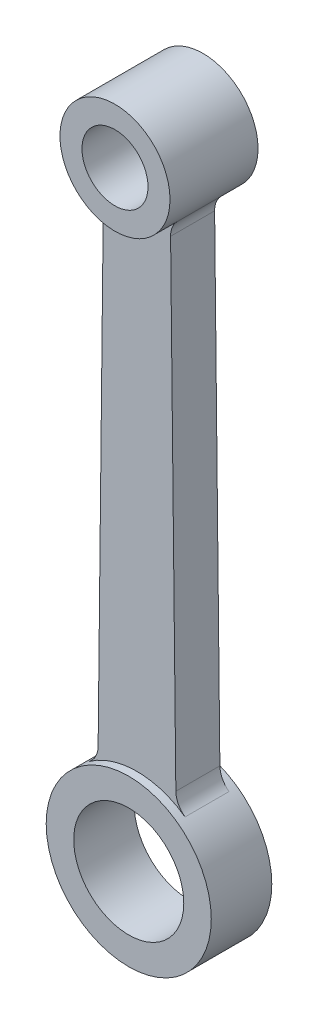
ISO-10303-21;
HEADER;
FILE_DESCRIPTION(('STEP AP214'),'2;1');
FILE_NAME('part.step','',(''),(''),'','','');
FILE_SCHEMA(('AUTOMOTIVE_DESIGN { 1 0 10303 214 1 1 1 1 }'));
ENDSEC;
DATA;
#1=APPLICATION_CONTEXT('core data for automotive mechanical design processes');
#2=APPLICATION_PROTOCOL_DEFINITION('international standard','automotive_design',2000,#1);
#3=PRODUCT_CONTEXT('',#1,'mechanical');
#4=PRODUCT('Part','Part','',(#3));
#5=PRODUCT_RELATED_PRODUCT_CATEGORY('part','',(#4));
#6=PRODUCT_DEFINITION_FORMATION('','',#4);
#7=PRODUCT_DEFINITION_CONTEXT('part definition',#1,'design');
#8=PRODUCT_DEFINITION('design','',#6,#7);
#9=PRODUCT_DEFINITION_SHAPE('','',#8);
#10=(LENGTH_UNIT() NAMED_UNIT(*) SI_UNIT(.MILLI.,.METRE.));
#11=(NAMED_UNIT(*) PLANE_ANGLE_UNIT() SI_UNIT($,.RADIAN.));
#12=(NAMED_UNIT(*) SI_UNIT($,.STERADIAN.) SOLID_ANGLE_UNIT());
#13=UNCERTAINTY_MEASURE_WITH_UNIT(LENGTH_MEASURE(1.E-05),#10,'distance_accuracy_value','');
#14=(GEOMETRIC_REPRESENTATION_CONTEXT(3) GLOBAL_UNCERTAINTY_ASSIGNED_CONTEXT((#13)) GLOBAL_UNIT_ASSIGNED_CONTEXT((#10,
#11,#12)) REPRESENTATION_CONTEXT('',''));
#15=CARTESIAN_POINT('',(0.,0.,0.));
#16=DIRECTION('',(0.,0.,1.));
#17=DIRECTION('',(1.,0.,0.));
#18=AXIS2_PLACEMENT_3D('',#15,#16,#17);
#19=CARTESIAN_POINT('',(0.,0.,2.75));
#20=DIRECTION('',(0.,0.,1.));
#21=DIRECTION('',(1.,0.,0.));
#22=AXIS2_PLACEMENT_3D('',#19,#20,#21);
#23=PLANE('',#22);
#24=CARTESIAN_POINT('',(0.,0.,2.75));
#25=DIRECTION('',(0.,0.,1.));
#26=DIRECTION('',(1.,0.,0.));
#27=AXIS2_PLACEMENT_3D('',#24,#25,#26);
#28=CIRCLE('',#27,7.5);
#29=CARTESIAN_POINT('',(7.5,0.,2.75));
#30=VERTEX_POINT('',#29);
#31=EDGE_CURVE('E125',#30,#30,#28,.T.);
#32=ORIENTED_EDGE('',*,*,#31,.T.);
#33=EDGE_LOOP('',(#32));
#34=FACE_BOUND('',#33,.T.);
#35=CARTESIAN_POINT('',(0.,0.,2.75));
#36=DIRECTION('',(0.,0.,1.));
#37=DIRECTION('',(1.,0.,0.));
#38=AXIS2_PLACEMENT_3D('',#35,#36,#37);
#39=CIRCLE('',#38,5.);
#40=CARTESIAN_POINT('',(5.,0.,2.75));
#41=VERTEX_POINT('',#40);
#42=EDGE_CURVE('E173',#41,#41,#39,.T.);
#43=ORIENTED_EDGE('',*,*,#42,.F.);
#44=EDGE_LOOP('',(#43));
#45=FACE_BOUND('',#44,.T.);
#46=ADVANCED_FACE('F37',(#34,#45),#23,.T.);
#47=CARTESIAN_POINT('',(0.,0.,-2.75));
#48=DIRECTION('',(0.,0.,1.));
#49=DIRECTION('',(1.,0.,0.));
#50=AXIS2_PLACEMENT_3D('',#47,#48,#49);
#51=PLANE('',#50);
#52=CARTESIAN_POINT('',(0.,0.,-2.75));
#53=DIRECTION('',(0.,0.,1.));
#54=DIRECTION('',(1.,0.,0.));
#55=AXIS2_PLACEMENT_3D('',#52,#53,#54);
#56=CIRCLE('',#55,7.5);
#57=CARTESIAN_POINT('',(7.5,0.,-2.75));
#58=VERTEX_POINT('',#57);
#59=EDGE_CURVE('E170',#58,#58,#56,.T.);
#60=ORIENTED_EDGE('',*,*,#59,.F.);
#61=EDGE_LOOP('',(#60));
#62=FACE_BOUND('',#61,.T.);
#63=CARTESIAN_POINT('',(0.,0.,-2.75));
#64=DIRECTION('',(0.,0.,1.));
#65=DIRECTION('',(1.,0.,0.));
#66=AXIS2_PLACEMENT_3D('',#63,#64,#65);
#67=CIRCLE('',#66,5.);
#68=CARTESIAN_POINT('',(5.,0.,-2.75));
#69=VERTEX_POINT('',#68);
#70=EDGE_CURVE('E176',#69,#69,#67,.T.);
#71=ORIENTED_EDGE('',*,*,#70,.T.);
#72=EDGE_LOOP('',(#71));
#73=FACE_BOUND('',#72,.T.);
#74=ADVANCED_FACE('F220',(#62,#73),#51,.F.);
#75=CARTESIAN_POINT('',(0.,0.,2.75));
#76=DIRECTION('',(0.,0.,-1.));
#77=DIRECTION('',(-1.,0.,0.));
#78=AXIS2_PLACEMENT_3D('',#75,#76,#77);
#79=CYLINDRICAL_SURFACE('',#78,7.5);
#80=DIRECTION('',(0.,0.,-1.));
#81=VECTOR('',#80,1.);
#82=CARTESIAN_POINT('',(-4.36669634359611,6.09770145569823,2.75));
#83=LINE('',#82,#81);
#84=CARTESIAN_POINT('',(-4.36669634359611,6.09770145569824,2.));
#85=VERTEX_POINT('',#84);
#86=CARTESIAN_POINT('',(-4.36669634359611,6.09770145569823,-2.));
#87=VERTEX_POINT('',#86);
#88=EDGE_CURVE('E148',#85,#87,#83,.T.);
#89=ORIENTED_EDGE('',*,*,#88,.T.);
#90=CARTESIAN_POINT('',(0.,0.,-2.));
#91=DIRECTION('',(0.,0.,-1.));
#92=DIRECTION('',(1.,0.,0.));
#93=AXIS2_PLACEMENT_3D('',#90,#91,#92);
#94=CIRCLE('',#93,7.5);
#95=CARTESIAN_POINT('',(4.36669634359611,6.09770145569823,-2.));
#96=VERTEX_POINT('',#95);
#97=EDGE_CURVE('E52',#87,#96,#94,.T.);
#98=ORIENTED_EDGE('',*,*,#97,.T.);
#99=DIRECTION('',(0.,0.,-1.));
#100=VECTOR('',#99,1.);
#101=CARTESIAN_POINT('',(4.36669634359611,6.09770145569823,2.75));
#102=LINE('',#101,#100);
#103=CARTESIAN_POINT('',(4.36669634359611,6.09770145569824,2.));
#104=VERTEX_POINT('',#103);
#105=EDGE_CURVE('E147',#96,#104,#102,.F.);
#106=ORIENTED_EDGE('',*,*,#105,.T.);
#107=CARTESIAN_POINT('',(0.,0.,2.));
#108=DIRECTION('',(0.,0.,-1.));
#109=DIRECTION('',(1.,0.,0.));
#110=AXIS2_PLACEMENT_3D('',#107,#108,#109);
#111=CIRCLE('',#110,7.5);
#112=EDGE_CURVE('E60',#85,#104,#111,.T.);
#113=ORIENTED_EDGE('',*,*,#112,.F.);
#114=EDGE_LOOP('',(#89,#98,#106,#113));
#115=FACE_BOUND('',#114,.T.);
#116=ORIENTED_EDGE('',*,*,#31,.F.);
#117=EDGE_LOOP('',(#116));
#118=FACE_BOUND('',#117,.T.);
#119=ORIENTED_EDGE('',*,*,#59,.T.);
#120=EDGE_LOOP('',(#119));
#121=FACE_BOUND('',#120,.T.);
#122=ADVANCED_FACE('F226',(#115,#118,#121),#79,.T.);
#123=CARTESIAN_POINT('',(0.,0.,2.75));
#124=DIRECTION('',(0.,0.,-1.));
#125=DIRECTION('',(-1.,0.,0.));
#126=AXIS2_PLACEMENT_3D('',#123,#124,#125);
#127=CYLINDRICAL_SURFACE('',#126,5.);
#128=ORIENTED_EDGE('',*,*,#42,.T.);
#129=EDGE_LOOP('',(#128));
#130=FACE_BOUND('',#129,.T.);
#131=ORIENTED_EDGE('',*,*,#70,.F.);
#132=EDGE_LOOP('',(#131));
#133=FACE_BOUND('',#132,.T.);
#134=ADVANCED_FACE('F231',(#130,#133),#127,.F.);
#135=CARTESIAN_POINT('',(-3.04380005873915,52.0332278610412,2.));
#136=DIRECTION('',(0.999939549282101,-0.0109953527232108,0.));
#137=DIRECTION('',(0.0109953527232108,0.999939549282102,0.));
#138=AXIS2_PLACEMENT_3D('',#135,#136,#137);
#139=PLANE('',#138);
#140=DIRECTION('',(-0.0109953527232108,-0.999939549282101,0.));
#141=VECTOR('',#140,1.);
#142=CARTESIAN_POINT('',(-3.04380005873915,52.0332278610412,2.));
#143=LINE('',#142,#141);
#144=CARTESIAN_POINT('',(-3.05368465527388,51.1343027194302,2.));
#145=VERTEX_POINT('',#144);
#146=CARTESIAN_POINT('',(-3.5312696033242,7.70176447177135,2.));
#147=VERTEX_POINT('',#146);
#148=EDGE_CURVE('E114',#145,#147,#143,.T.);
#149=ORIENTED_EDGE('',*,*,#148,.F.);
#150=DIRECTION('',(0.,0.,1.));
#151=VECTOR('',#150,1.);
#152=CARTESIAN_POINT('',(-3.05368465527388,51.1343027194302,-2.));
#153=LINE('',#152,#151);
#154=CARTESIAN_POINT('',(-3.05368465527388,51.1343027194302,-2.));
#155=VERTEX_POINT('',#154);
#156=EDGE_CURVE('E130',#145,#155,#153,.F.);
#157=ORIENTED_EDGE('',*,*,#156,.T.);
#158=DIRECTION('',(-0.0109953527232108,-0.999939549282101,0.));
#159=VECTOR('',#158,1.);
#160=CARTESIAN_POINT('',(-3.04380005873915,52.0332278610412,-2.));
#161=LINE('',#160,#159);
#162=CARTESIAN_POINT('',(-3.5312696033242,7.70176447177135,-2.));
#163=VERTEX_POINT('',#162);
#164=EDGE_CURVE('E183',#155,#163,#161,.T.);
#165=ORIENTED_EDGE('',*,*,#164,.T.);
#166=DIRECTION('',(0.,0.,1.));
#167=VECTOR('',#166,1.);
#168=CARTESIAN_POINT('',(-3.5312696033242,7.70176447177134,2.));
#169=LINE('',#168,#167);
#170=EDGE_CURVE('E152',#163,#147,#169,.T.);
#171=ORIENTED_EDGE('',*,*,#170,.T.);
#172=EDGE_LOOP('',(#149,#157,#165,#171));
#173=FACE_BOUND('',#172,.T.);
#174=ADVANCED_FACE('F249',(#173),#139,.F.);
#175=CARTESIAN_POINT('',(3.04380005873915,52.0332278610412,2.));
#176=DIRECTION('',(-0.999939549282101,-0.0109953527232108,0.));
#177=DIRECTION('',(0.0109953527232108,-0.999939549282102,0.));
#178=AXIS2_PLACEMENT_3D('',#175,#176,#177);
#179=PLANE('',#178);
#180=DIRECTION('',(-0.0109953527232108,0.999939549282101,0.));
#181=VECTOR('',#180,1.);
#182=CARTESIAN_POINT('',(3.04380005873915,52.0332278610412,-2.));
#183=LINE('',#182,#181);
#184=CARTESIAN_POINT('',(3.5312696033242,7.70176447177135,-2.));
#185=VERTEX_POINT('',#184);
#186=CARTESIAN_POINT('',(3.05368465527388,51.1343027194302,-2.));
#187=VERTEX_POINT('',#186);
#188=EDGE_CURVE('E115',#185,#187,#183,.T.);
#189=ORIENTED_EDGE('',*,*,#188,.T.);
#190=DIRECTION('',(0.,0.,1.));
#191=VECTOR('',#190,1.);
#192=CARTESIAN_POINT('',(3.05368465527388,51.1343027194302,2.));
#193=LINE('',#192,#191);
#194=CARTESIAN_POINT('',(3.05368465527388,51.1343027194302,2.));
#195=VERTEX_POINT('',#194);
#196=EDGE_CURVE('E162',#187,#195,#193,.T.);
#197=ORIENTED_EDGE('',*,*,#196,.T.);
#198=DIRECTION('',(-0.0109953527232108,0.999939549282101,0.));
#199=VECTOR('',#198,1.);
#200=CARTESIAN_POINT('',(3.04380005873915,52.0332278610412,2.));
#201=LINE('',#200,#199);
#202=CARTESIAN_POINT('',(3.5312696033242,7.70176447177135,2.));
#203=VERTEX_POINT('',#202);
#204=EDGE_CURVE('E179',#203,#195,#201,.T.);
#205=ORIENTED_EDGE('',*,*,#204,.F.);
#206=DIRECTION('',(0.,0.,1.));
#207=VECTOR('',#206,1.);
#208=CARTESIAN_POINT('',(3.5312696033242,7.70176447177134,-2.));
#209=LINE('',#208,#207);
#210=EDGE_CURVE('E163',#203,#185,#209,.F.);
#211=ORIENTED_EDGE('',*,*,#210,.T.);
#212=EDGE_LOOP('',(#189,#197,#205,#211));
#213=FACE_BOUND('',#212,.T.);
#214=ADVANCED_FACE('F160',(#213),#179,.F.);
#215=CARTESIAN_POINT('',(0.,56.,2.));
#216=DIRECTION('',(0.,0.,1.));
#217=DIRECTION('',(1.,0.,0.));
#218=AXIS2_PLACEMENT_3D('',#215,#216,#217);
#219=PLANE('',#218);
#220=CARTESIAN_POINT('',(0.,56.,2.));
#221=DIRECTION('',(0.,0.,-1.));
#222=DIRECTION('',(1.,0.,0.));
#223=AXIS2_PLACEMENT_3D('',#220,#221,#222);
#224=CIRCLE('',#223,5.);
#225=CARTESIAN_POINT('',(3.60968839559863,52.5402095891976,2.));
#226=VERTEX_POINT('',#225);
#227=CARTESIAN_POINT('',(-3.60968839559863,52.5402095891976,2.));
#228=VERTEX_POINT('',#227);
#229=EDGE_CURVE('E101',#226,#228,#224,.T.);
#230=ORIENTED_EDGE('',*,*,#229,.T.);
#231=CARTESIAN_POINT('',(-5.05356375383809,51.1562934248766,2.));
#232=DIRECTION('',(0.,0.,1.));
#233=DIRECTION('',(1.,0.,0.));
#234=AXIS2_PLACEMENT_3D('',#231,#232,#233);
#235=CIRCLE('',#234,2.);
#236=EDGE_CURVE('E106',#228,#145,#235,.F.);
#237=ORIENTED_EDGE('',*,*,#236,.T.);
#238=ORIENTED_EDGE('',*,*,#148,.T.);
#239=CARTESIAN_POINT('',(-5.5311487018884,7.72375517721776,2.));
#240=DIRECTION('',(0.,0.,1.));
#241=DIRECTION('',(1.,0.,0.));
#242=AXIS2_PLACEMENT_3D('',#239,#240,#241);
#243=CIRCLE('',#242,2.);
#244=EDGE_CURVE('E134',#147,#85,#243,.F.);
#245=ORIENTED_EDGE('',*,*,#244,.T.);
#246=ORIENTED_EDGE('',*,*,#112,.T.);
#247=CARTESIAN_POINT('',(5.5311487018884,7.72375517721776,2.));
#248=DIRECTION('',(0.,0.,1.));
#249=DIRECTION('',(1.,0.,0.));
#250=AXIS2_PLACEMENT_3D('',#247,#248,#249);
#251=CIRCLE('',#250,2.);
#252=EDGE_CURVE('E11',#104,#203,#251,.F.);
#253=ORIENTED_EDGE('',*,*,#252,.T.);
#254=ORIENTED_EDGE('',*,*,#204,.T.);
#255=CARTESIAN_POINT('',(5.05356375383809,51.1562934248766,2.));
#256=DIRECTION('',(0.,0.,1.));
#257=DIRECTION('',(1.,0.,0.));
#258=AXIS2_PLACEMENT_3D('',#255,#256,#257);
#259=CIRCLE('',#258,2.);
#260=EDGE_CURVE('E110',#195,#226,#259,.F.);
#261=ORIENTED_EDGE('',*,*,#260,.T.);
#262=EDGE_LOOP('',(#230,#237,#238,#245,#246,#253,#254,#261));
#263=FACE_BOUND('',#262,.T.);
#264=ADVANCED_FACE('F103',(#263),#219,.T.);
#265=CARTESIAN_POINT('',(0.,56.,-2.));
#266=DIRECTION('',(0.,0.,1.));
#267=DIRECTION('',(1.,0.,0.));
#268=AXIS2_PLACEMENT_3D('',#265,#266,#267);
#269=PLANE('',#268);
#270=CARTESIAN_POINT('',(0.,56.,-2.));
#271=DIRECTION('',(0.,0.,-1.));
#272=DIRECTION('',(1.,0.,0.));
#273=AXIS2_PLACEMENT_3D('',#270,#271,#272);
#274=CIRCLE('',#273,5.);
#275=CARTESIAN_POINT('',(3.60968839559863,52.5402095891976,-2.));
#276=VERTEX_POINT('',#275);
#277=CARTESIAN_POINT('',(-3.60968839559863,52.5402095891976,-2.));
#278=VERTEX_POINT('',#277);
#279=EDGE_CURVE('E121',#276,#278,#274,.T.);
#280=ORIENTED_EDGE('',*,*,#279,.F.);
#281=CARTESIAN_POINT('',(5.05356375383809,51.1562934248766,-2.));
#282=DIRECTION('',(0.,0.,1.));
#283=DIRECTION('',(1.,0.,0.));
#284=AXIS2_PLACEMENT_3D('',#281,#282,#283);
#285=CIRCLE('',#284,2.);
#286=EDGE_CURVE('E150',#276,#187,#285,.T.);
#287=ORIENTED_EDGE('',*,*,#286,.T.);
#288=ORIENTED_EDGE('',*,*,#188,.F.);
#289=CARTESIAN_POINT('',(5.5311487018884,7.72375517721776,-2.));
#290=DIRECTION('',(0.,0.,1.));
#291=DIRECTION('',(1.,0.,0.));
#292=AXIS2_PLACEMENT_3D('',#289,#290,#291);
#293=CIRCLE('',#292,2.);
#294=EDGE_CURVE('E45',#185,#96,#293,.T.);
#295=ORIENTED_EDGE('',*,*,#294,.T.);
#296=ORIENTED_EDGE('',*,*,#97,.F.);
#297=CARTESIAN_POINT('',(-5.5311487018884,7.72375517721776,-2.));
#298=DIRECTION('',(0.,0.,1.));
#299=DIRECTION('',(1.,0.,0.));
#300=AXIS2_PLACEMENT_3D('',#297,#298,#299);
#301=CIRCLE('',#300,2.);
#302=EDGE_CURVE('E131',#87,#163,#301,.T.);
#303=ORIENTED_EDGE('',*,*,#302,.T.);
#304=ORIENTED_EDGE('',*,*,#164,.F.);
#305=CARTESIAN_POINT('',(-5.05356375383809,51.1562934248766,-2.));
#306=DIRECTION('',(0.,0.,1.));
#307=DIRECTION('',(1.,0.,0.));
#308=AXIS2_PLACEMENT_3D('',#305,#306,#307);
#309=CIRCLE('',#308,2.);
#310=EDGE_CURVE('E132',#155,#278,#309,.T.);
#311=ORIENTED_EDGE('',*,*,#310,.T.);
#312=EDGE_LOOP('',(#280,#287,#288,#295,#296,#303,#304,#311));
#313=FACE_BOUND('',#312,.T.);
#314=ADVANCED_FACE('F141',(#313),#269,.F.);
#315=CARTESIAN_POINT('',(0.,56.,4.));
#316=DIRECTION('',(0.,0.,1.));
#317=DIRECTION('',(1.,0.,0.));
#318=AXIS2_PLACEMENT_3D('',#315,#316,#317);
#319=PLANE('',#318);
#320=CARTESIAN_POINT('',(0.,56.,4.));
#321=DIRECTION('',(0.,0.,1.));
#322=DIRECTION('',(1.,0.,0.));
#323=AXIS2_PLACEMENT_3D('',#320,#321,#322);
#324=CIRCLE('',#323,5.);
#325=CARTESIAN_POINT('',(5.,56.,4.));
#326=VERTEX_POINT('',#325);
#327=EDGE_CURVE('E187',#326,#326,#324,.T.);
#328=ORIENTED_EDGE('',*,*,#327,.T.);
#329=EDGE_LOOP('',(#328));
#330=FACE_BOUND('',#329,.T.);
#331=CARTESIAN_POINT('',(0.,56.,4.));
#332=DIRECTION('',(0.,0.,1.));
#333=DIRECTION('',(1.,0.,0.));
#334=AXIS2_PLACEMENT_3D('',#331,#332,#333);
#335=CIRCLE('',#334,3.);
#336=CARTESIAN_POINT('',(3.,56.,4.));
#337=VERTEX_POINT('',#336);
#338=EDGE_CURVE('E194',#337,#337,#335,.T.);
#339=ORIENTED_EDGE('',*,*,#338,.F.);
#340=EDGE_LOOP('',(#339));
#341=FACE_BOUND('',#340,.T.);
#342=ADVANCED_FACE('F206',(#330,#341),#319,.T.);
#343=CARTESIAN_POINT('',(0.,56.,-4.));
#344=DIRECTION('',(0.,0.,1.));
#345=DIRECTION('',(1.,0.,0.));
#346=AXIS2_PLACEMENT_3D('',#343,#344,#345);
#347=PLANE('',#346);
#348=CARTESIAN_POINT('',(0.,56.,-4.));
#349=DIRECTION('',(0.,0.,1.));
#350=DIRECTION('',(1.,0.,0.));
#351=AXIS2_PLACEMENT_3D('',#348,#349,#350);
#352=CIRCLE('',#351,5.);
#353=CARTESIAN_POINT('',(5.,56.,-4.));
#354=VERTEX_POINT('',#353);
#355=EDGE_CURVE('E191',#354,#354,#352,.T.);
#356=ORIENTED_EDGE('',*,*,#355,.F.);
#357=EDGE_LOOP('',(#356));
#358=FACE_BOUND('',#357,.T.);
#359=CARTESIAN_POINT('',(0.,56.,-4.));
#360=DIRECTION('',(0.,0.,1.));
#361=DIRECTION('',(1.,0.,0.));
#362=AXIS2_PLACEMENT_3D('',#359,#360,#361);
#363=CIRCLE('',#362,3.);
#364=CARTESIAN_POINT('',(3.,56.,-4.));
#365=VERTEX_POINT('',#364);
#366=EDGE_CURVE('E197',#365,#365,#363,.T.);
#367=ORIENTED_EDGE('',*,*,#366,.T.);
#368=EDGE_LOOP('',(#367));
#369=FACE_BOUND('',#368,.T.);
#370=ADVANCED_FACE('F208',(#358,#369),#347,.F.);
#371=CARTESIAN_POINT('',(0.,56.,4.));
#372=DIRECTION('',(0.,0.,-1.));
#373=DIRECTION('',(-1.,0.,0.));
#374=AXIS2_PLACEMENT_3D('',#371,#372,#373);
#375=CYLINDRICAL_SURFACE('',#374,5.);
#376=DIRECTION('',(0.,0.,-1.));
#377=VECTOR('',#376,1.);
#378=CARTESIAN_POINT('',(3.60968839559863,52.5402095891976,4.));
#379=LINE('',#378,#377);
#380=EDGE_CURVE('E124',#226,#276,#379,.T.);
#381=ORIENTED_EDGE('',*,*,#380,.T.);
#382=ORIENTED_EDGE('',*,*,#279,.T.);
#383=DIRECTION('',(0.,0.,-1.));
#384=VECTOR('',#383,1.);
#385=CARTESIAN_POINT('',(-3.60968839559863,52.5402095891976,4.));
#386=LINE('',#385,#384);
#387=EDGE_CURVE('E118',#278,#228,#386,.F.);
#388=ORIENTED_EDGE('',*,*,#387,.T.);
#389=ORIENTED_EDGE('',*,*,#229,.F.);
#390=EDGE_LOOP('',(#381,#382,#388,#389));
#391=FACE_BOUND('',#390,.T.);
#392=ORIENTED_EDGE('',*,*,#327,.F.);
#393=EDGE_LOOP('',(#392));
#394=FACE_BOUND('',#393,.T.);
#395=ORIENTED_EDGE('',*,*,#355,.T.);
#396=EDGE_LOOP('',(#395));
#397=FACE_BOUND('',#396,.T.);
#398=ADVANCED_FACE('F119',(#391,#394,#397),#375,.T.);
#399=CARTESIAN_POINT('',(0.,56.,4.));
#400=DIRECTION('',(0.,0.,-1.));
#401=DIRECTION('',(-1.,0.,0.));
#402=AXIS2_PLACEMENT_3D('',#399,#400,#401);
#403=CYLINDRICAL_SURFACE('',#402,3.);
#404=ORIENTED_EDGE('',*,*,#338,.T.);
#405=EDGE_LOOP('',(#404));
#406=FACE_BOUND('',#405,.T.);
#407=ORIENTED_EDGE('',*,*,#366,.F.);
#408=EDGE_LOOP('',(#407));
#409=FACE_BOUND('',#408,.T.);
#410=ADVANCED_FACE('F203',(#406,#409),#403,.F.);
#411=CARTESIAN_POINT('',(5.05356375383809,51.1562934248766,4.));
#412=DIRECTION('',(0.,0.,-1.));
#413=DIRECTION('',(-1.,0.,0.));
#414=AXIS2_PLACEMENT_3D('',#411,#412,#413);
#415=CYLINDRICAL_SURFACE('',#414,2.);
#416=ORIENTED_EDGE('',*,*,#260,.F.);
#417=ORIENTED_EDGE('',*,*,#196,.F.);
#418=ORIENTED_EDGE('',*,*,#286,.F.);
#419=ORIENTED_EDGE('',*,*,#380,.F.);
#420=EDGE_LOOP('',(#416,#417,#418,#419));
#421=FACE_BOUND('',#420,.T.);
#422=ADVANCED_FACE('F165',(#421),#415,.F.);
#423=CARTESIAN_POINT('',(-5.05356375383809,51.1562934248766,4.));
#424=DIRECTION('',(0.,0.,-1.));
#425=DIRECTION('',(-1.,0.,0.));
#426=AXIS2_PLACEMENT_3D('',#423,#424,#425);
#427=CYLINDRICAL_SURFACE('',#426,2.);
#428=ORIENTED_EDGE('',*,*,#236,.F.);
#429=ORIENTED_EDGE('',*,*,#387,.F.);
#430=ORIENTED_EDGE('',*,*,#310,.F.);
#431=ORIENTED_EDGE('',*,*,#156,.F.);
#432=EDGE_LOOP('',(#428,#429,#430,#431));
#433=FACE_BOUND('',#432,.T.);
#434=ADVANCED_FACE('F128',(#433),#427,.F.);
#435=CARTESIAN_POINT('',(-5.5311487018884,7.72375517721776,2.75));
#436=DIRECTION('',(0.,0.,-1.));
#437=DIRECTION('',(-1.,0.,0.));
#438=AXIS2_PLACEMENT_3D('',#435,#436,#437);
#439=CYLINDRICAL_SURFACE('',#438,2.);
#440=ORIENTED_EDGE('',*,*,#244,.F.);
#441=ORIENTED_EDGE('',*,*,#170,.F.);
#442=ORIENTED_EDGE('',*,*,#302,.F.);
#443=ORIENTED_EDGE('',*,*,#88,.F.);
#444=EDGE_LOOP('',(#440,#441,#442,#443));
#445=FACE_BOUND('',#444,.T.);
#446=ADVANCED_FACE('F239',(#445),#439,.F.);
#447=CARTESIAN_POINT('',(5.5311487018884,7.72375517721776,2.75));
#448=DIRECTION('',(0.,0.,-1.));
#449=DIRECTION('',(-1.,0.,0.));
#450=AXIS2_PLACEMENT_3D('',#447,#448,#449);
#451=CYLINDRICAL_SURFACE('',#450,2.);
#452=ORIENTED_EDGE('',*,*,#252,.F.);
#453=ORIENTED_EDGE('',*,*,#105,.F.);
#454=ORIENTED_EDGE('',*,*,#294,.F.);
#455=ORIENTED_EDGE('',*,*,#210,.F.);
#456=EDGE_LOOP('',(#452,#453,#454,#455));
#457=FACE_BOUND('',#456,.T.);
#458=ADVANCED_FACE('F39',(#457),#451,.F.);
#459=CLOSED_SHELL('',(#46,#74,#122,#134,#174,#214,#264,#314,#342,#370,#398,#410,#422,#434,#446,#458));
#460=MANIFOLD_SOLID_BREP('B2',#459);
#461=ADVANCED_BREP_SHAPE_REPRESENTATION('',(#18,#460),#14);
#462=SHAPE_DEFINITION_REPRESENTATION(#9,#461);
ENDSEC;
END-ISO-10303-21;
